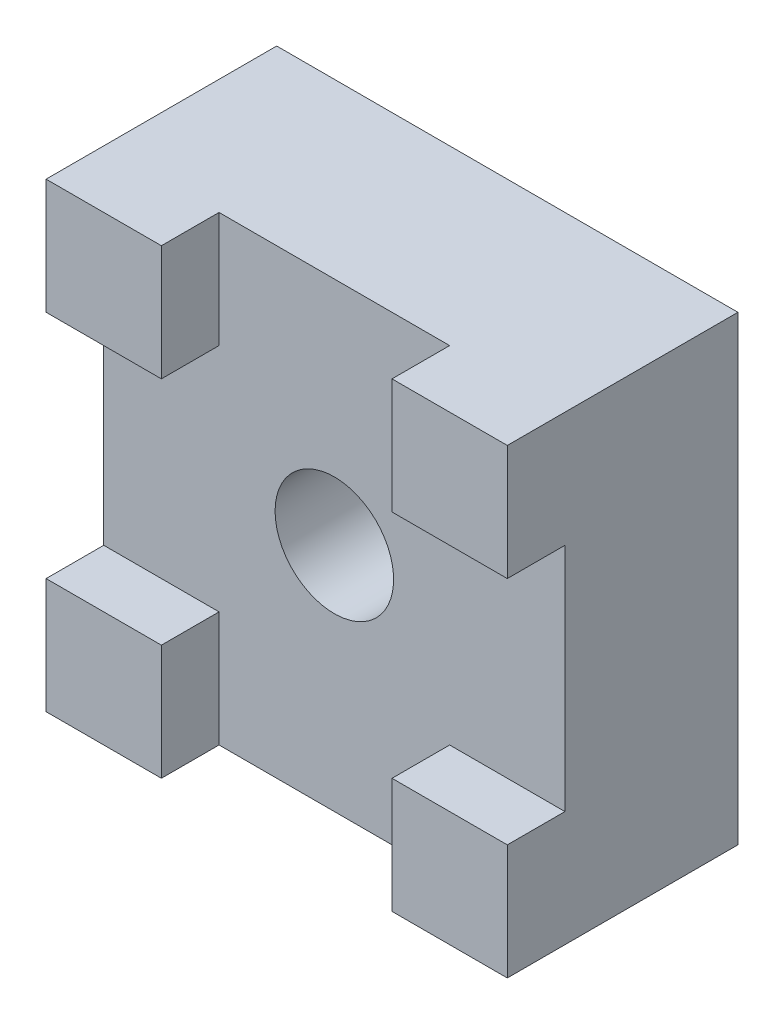
ISO-10303-21;
HEADER;
FILE_DESCRIPTION(('STEP AP214'),'2;1');
FILE_NAME('part.step','',(''),(''),'','','');
FILE_SCHEMA(('AUTOMOTIVE_DESIGN { 1 0 10303 214 1 1 1 1 }'));
ENDSEC;
DATA;
#1=APPLICATION_CONTEXT('core data for automotive mechanical design processes');
#2=APPLICATION_PROTOCOL_DEFINITION('international standard','automotive_design',2000,#1);
#3=PRODUCT_CONTEXT('',#1,'mechanical');
#4=PRODUCT('Part','Part','',(#3));
#5=PRODUCT_RELATED_PRODUCT_CATEGORY('part','',(#4));
#6=PRODUCT_DEFINITION_FORMATION('','',#4);
#7=PRODUCT_DEFINITION_CONTEXT('part definition',#1,'design');
#8=PRODUCT_DEFINITION('design','',#6,#7);
#9=PRODUCT_DEFINITION_SHAPE('','',#8);
#10=(LENGTH_UNIT() NAMED_UNIT(*) SI_UNIT(.MILLI.,.METRE.));
#11=(NAMED_UNIT(*) PLANE_ANGLE_UNIT() SI_UNIT($,.RADIAN.));
#12=(NAMED_UNIT(*) SI_UNIT($,.STERADIAN.) SOLID_ANGLE_UNIT());
#13=UNCERTAINTY_MEASURE_WITH_UNIT(LENGTH_MEASURE(1.E-05),#10,'distance_accuracy_value','');
#14=(GEOMETRIC_REPRESENTATION_CONTEXT(3) GLOBAL_UNCERTAINTY_ASSIGNED_CONTEXT((#13)) GLOBAL_UNIT_ASSIGNED_CONTEXT((#10,
#11,#12)) REPRESENTATION_CONTEXT('',''));
#15=CARTESIAN_POINT('',(0.,0.,0.));
#16=DIRECTION('',(0.,0.,1.));
#17=DIRECTION('',(1.,0.,0.));
#18=AXIS2_PLACEMENT_3D('',#15,#16,#17);
#19=CARTESIAN_POINT('',(-12.7,-12.7,9.525));
#20=DIRECTION('',(0.,1.,0.));
#21=DIRECTION('',(-1.,0.,0.));
#22=AXIS2_PLACEMENT_3D('',#19,#20,#21);
#23=PLANE('',#22);
#24=DIRECTION('',(1.,0.,0.));
#25=VECTOR('',#24,1.);
#26=CARTESIAN_POINT('',(-12.7,-12.7,0.));
#27=LINE('',#26,#25);
#28=CARTESIAN_POINT('',(-12.7,-12.7,0.));
#29=VERTEX_POINT('',#28);
#30=CARTESIAN_POINT('',(12.7,-12.7,0.));
#31=VERTEX_POINT('',#30);
#32=EDGE_CURVE('E307',#29,#31,#27,.T.);
#33=ORIENTED_EDGE('',*,*,#32,.T.);
#34=DIRECTION('',(0.,0.,-1.));
#35=VECTOR('',#34,1.);
#36=CARTESIAN_POINT('',(12.7,-12.7,9.525));
#37=LINE('',#36,#35);
#38=CARTESIAN_POINT('',(12.7,-12.7,12.7));
#39=VERTEX_POINT('',#38);
#40=EDGE_CURVE('E11',#39,#31,#37,.T.);
#41=ORIENTED_EDGE('',*,*,#40,.F.);
#42=DIRECTION('',(1.,0.,0.));
#43=VECTOR('',#42,1.);
#44=CARTESIAN_POINT('',(12.7,-12.7,12.7));
#45=LINE('',#44,#43);
#46=CARTESIAN_POINT('',(6.35,-12.7,12.7));
#47=VERTEX_POINT('',#46);
#48=EDGE_CURVE('E216',#47,#39,#45,.T.);
#49=ORIENTED_EDGE('',*,*,#48,.F.);
#50=DIRECTION('',(0.,0.,-1.));
#51=VECTOR('',#50,1.);
#52=CARTESIAN_POINT('',(6.35,-12.7,12.7));
#53=LINE('',#52,#51);
#54=CARTESIAN_POINT('',(6.35,-12.7,9.525));
#55=VERTEX_POINT('',#54);
#56=EDGE_CURVE('E215',#47,#55,#53,.T.);
#57=ORIENTED_EDGE('',*,*,#56,.T.);
#58=DIRECTION('',(1.,0.,0.));
#59=VECTOR('',#58,1.);
#60=CARTESIAN_POINT('',(-12.7,-12.7,9.525));
#61=LINE('',#60,#59);
#62=CARTESIAN_POINT('',(-6.35,-12.7,9.525));
#63=VERTEX_POINT('',#62);
#64=EDGE_CURVE('E315',#63,#55,#61,.T.);
#65=ORIENTED_EDGE('',*,*,#64,.F.);
#66=DIRECTION('',(0.,0.,-1.));
#67=VECTOR('',#66,1.);
#68=CARTESIAN_POINT('',(-6.35,-12.7,12.7));
#69=LINE('',#68,#67);
#70=CARTESIAN_POINT('',(-6.35,-12.7,12.7));
#71=VERTEX_POINT('',#70);
#72=EDGE_CURVE('E180',#71,#63,#69,.T.);
#73=ORIENTED_EDGE('',*,*,#72,.F.);
#74=DIRECTION('',(1.,0.,0.));
#75=VECTOR('',#74,1.);
#76=CARTESIAN_POINT('',(-12.7,-12.7,12.7));
#77=LINE('',#76,#75);
#78=CARTESIAN_POINT('',(-12.7,-12.7,12.7));
#79=VERTEX_POINT('',#78);
#80=EDGE_CURVE('E197',#79,#71,#77,.T.);
#81=ORIENTED_EDGE('',*,*,#80,.F.);
#82=DIRECTION('',(0.,0.,-1.));
#83=VECTOR('',#82,1.);
#84=CARTESIAN_POINT('',(-12.7,-12.7,9.525));
#85=LINE('',#84,#83);
#86=EDGE_CURVE('E324',#79,#29,#85,.T.);
#87=ORIENTED_EDGE('',*,*,#86,.T.);
#88=EDGE_LOOP('',(#33,#41,#49,#57,#65,#73,#81,#87));
#89=FACE_BOUND('',#88,.T.);
#90=ADVANCED_FACE('F44',(#89),#23,.F.);
#91=CARTESIAN_POINT('',(12.7,-12.7,9.525));
#92=DIRECTION('',(-1.,0.,0.));
#93=DIRECTION('',(0.,0.,1.));
#94=AXIS2_PLACEMENT_3D('',#91,#92,#93);
#95=PLANE('',#94);
#96=DIRECTION('',(0.,1.,0.));
#97=VECTOR('',#96,1.);
#98=CARTESIAN_POINT('',(12.7,-12.7,0.));
#99=LINE('',#98,#97);
#100=CARTESIAN_POINT('',(12.7,12.7,0.));
#101=VERTEX_POINT('',#100);
#102=EDGE_CURVE('E328',#31,#101,#99,.T.);
#103=ORIENTED_EDGE('',*,*,#102,.T.);
#104=DIRECTION('',(0.,0.,-1.));
#105=VECTOR('',#104,1.);
#106=CARTESIAN_POINT('',(12.7,12.7,9.525));
#107=LINE('',#106,#105);
#108=CARTESIAN_POINT('',(12.7,12.7,12.7));
#109=VERTEX_POINT('',#108);
#110=EDGE_CURVE('E53',#109,#101,#107,.T.);
#111=ORIENTED_EDGE('',*,*,#110,.F.);
#112=DIRECTION('',(0.,1.,0.));
#113=VECTOR('',#112,1.);
#114=CARTESIAN_POINT('',(12.7,12.7,12.7));
#115=LINE('',#114,#113);
#116=CARTESIAN_POINT('',(12.7,6.35,12.7));
#117=VERTEX_POINT('',#116);
#118=EDGE_CURVE('E260',#117,#109,#115,.T.);
#119=ORIENTED_EDGE('',*,*,#118,.F.);
#120=DIRECTION('',(0.,0.,-1.));
#121=VECTOR('',#120,1.);
#122=CARTESIAN_POINT('',(12.7,6.35,12.7));
#123=LINE('',#122,#121);
#124=CARTESIAN_POINT('',(12.7,6.35,9.525));
#125=VERTEX_POINT('',#124);
#126=EDGE_CURVE('E238',#117,#125,#123,.T.);
#127=ORIENTED_EDGE('',*,*,#126,.T.);
#128=DIRECTION('',(0.,1.,0.));
#129=VECTOR('',#128,1.);
#130=CARTESIAN_POINT('',(12.7,-12.7,9.525));
#131=LINE('',#130,#129);
#132=CARTESIAN_POINT('',(12.7,-6.35,9.525));
#133=VERTEX_POINT('',#132);
#134=EDGE_CURVE('E312',#133,#125,#131,.T.);
#135=ORIENTED_EDGE('',*,*,#134,.F.);
#136=DIRECTION('',(0.,0.,-1.));
#137=VECTOR('',#136,1.);
#138=CARTESIAN_POINT('',(12.7,-6.35,12.7));
#139=LINE('',#138,#137);
#140=CARTESIAN_POINT('',(12.7,-6.35,12.7));
#141=VERTEX_POINT('',#140);
#142=EDGE_CURVE('E201',#141,#133,#139,.T.);
#143=ORIENTED_EDGE('',*,*,#142,.F.);
#144=DIRECTION('',(0.,1.,0.));
#145=VECTOR('',#144,1.);
#146=CARTESIAN_POINT('',(12.7,-12.7,12.7));
#147=LINE('',#146,#145);
#148=EDGE_CURVE('E222',#39,#141,#147,.T.);
#149=ORIENTED_EDGE('',*,*,#148,.F.);
#150=ORIENTED_EDGE('',*,*,#40,.T.);
#151=EDGE_LOOP('',(#103,#111,#119,#127,#135,#143,#149,#150));
#152=FACE_BOUND('',#151,.T.);
#153=ADVANCED_FACE('F355',(#152),#95,.F.);
#154=CARTESIAN_POINT('',(-12.7,12.7,9.525));
#155=DIRECTION('',(0.,1.,0.));
#156=DIRECTION('',(-1.,0.,0.));
#157=AXIS2_PLACEMENT_3D('',#154,#155,#156);
#158=PLANE('',#157);
#159=DIRECTION('',(1.,0.,0.));
#160=VECTOR('',#159,1.);
#161=CARTESIAN_POINT('',(-12.7,12.7,0.));
#162=LINE('',#161,#160);
#163=CARTESIAN_POINT('',(-12.7,12.7,0.));
#164=VERTEX_POINT('',#163);
#165=EDGE_CURVE('E334',#164,#101,#162,.T.);
#166=ORIENTED_EDGE('',*,*,#165,.F.);
#167=DIRECTION('',(0.,0.,-1.));
#168=VECTOR('',#167,1.);
#169=CARTESIAN_POINT('',(-12.7,12.7,9.525));
#170=LINE('',#169,#168);
#171=CARTESIAN_POINT('',(-12.7,12.7,12.7));
#172=VERTEX_POINT('',#171);
#173=EDGE_CURVE('E341',#172,#164,#170,.T.);
#174=ORIENTED_EDGE('',*,*,#173,.F.);
#175=DIRECTION('',(-1.,0.,0.));
#176=VECTOR('',#175,1.);
#177=CARTESIAN_POINT('',(-12.7,12.7,12.7));
#178=LINE('',#177,#176);
#179=CARTESIAN_POINT('',(-6.35,12.7,12.7));
#180=VERTEX_POINT('',#179);
#181=EDGE_CURVE('E279',#180,#172,#178,.T.);
#182=ORIENTED_EDGE('',*,*,#181,.F.);
#183=DIRECTION('',(0.,0.,-1.));
#184=VECTOR('',#183,1.);
#185=CARTESIAN_POINT('',(-6.35,12.7,12.7));
#186=LINE('',#185,#184);
#187=CARTESIAN_POINT('',(-6.35,12.7,9.525));
#188=VERTEX_POINT('',#187);
#189=EDGE_CURVE('E281',#180,#188,#186,.T.);
#190=ORIENTED_EDGE('',*,*,#189,.T.);
#191=DIRECTION('',(1.,0.,0.));
#192=VECTOR('',#191,1.);
#193=CARTESIAN_POINT('',(-12.7,12.7,9.525));
#194=LINE('',#193,#192);
#195=CARTESIAN_POINT('',(6.35,12.7,9.525));
#196=VERTEX_POINT('',#195);
#197=EDGE_CURVE('E317',#188,#196,#194,.T.);
#198=ORIENTED_EDGE('',*,*,#197,.T.);
#199=DIRECTION('',(0.,0.,-1.));
#200=VECTOR('',#199,1.);
#201=CARTESIAN_POINT('',(6.35,12.7,12.7));
#202=LINE('',#201,#200);
#203=CARTESIAN_POINT('',(6.35,12.7,12.7));
#204=VERTEX_POINT('',#203);
#205=EDGE_CURVE('E243',#204,#196,#202,.T.);
#206=ORIENTED_EDGE('',*,*,#205,.F.);
#207=DIRECTION('',(-1.,0.,0.));
#208=VECTOR('',#207,1.);
#209=CARTESIAN_POINT('',(6.35,12.7,12.7));
#210=LINE('',#209,#208);
#211=EDGE_CURVE('E250',#109,#204,#210,.T.);
#212=ORIENTED_EDGE('',*,*,#211,.F.);
#213=ORIENTED_EDGE('',*,*,#110,.T.);
#214=EDGE_LOOP('',(#166,#174,#182,#190,#198,#206,#212,#213));
#215=FACE_BOUND('',#214,.T.);
#216=ADVANCED_FACE('F349',(#215),#158,.T.);
#217=CARTESIAN_POINT('',(-12.7,-12.7,9.525));
#218=DIRECTION('',(-1.,0.,0.));
#219=DIRECTION('',(0.,0.,1.));
#220=AXIS2_PLACEMENT_3D('',#217,#218,#219);
#221=PLANE('',#220);
#222=DIRECTION('',(0.,1.,0.));
#223=VECTOR('',#222,1.);
#224=CARTESIAN_POINT('',(-12.7,-12.7,0.));
#225=LINE('',#224,#223);
#226=EDGE_CURVE('E316',#29,#164,#225,.T.);
#227=ORIENTED_EDGE('',*,*,#226,.F.);
#228=ORIENTED_EDGE('',*,*,#86,.F.);
#229=DIRECTION('',(0.,-1.,0.));
#230=VECTOR('',#229,1.);
#231=CARTESIAN_POINT('',(-12.7,-6.35,12.7));
#232=LINE('',#231,#230);
#233=CARTESIAN_POINT('',(-12.7,-6.35,12.7));
#234=VERTEX_POINT('',#233);
#235=EDGE_CURVE('E169',#234,#79,#232,.T.);
#236=ORIENTED_EDGE('',*,*,#235,.F.);
#237=DIRECTION('',(0.,0.,-1.));
#238=VECTOR('',#237,1.);
#239=CARTESIAN_POINT('',(-12.7,-6.35,12.7));
#240=LINE('',#239,#238);
#241=CARTESIAN_POINT('',(-12.7,-6.35,9.525));
#242=VERTEX_POINT('',#241);
#243=EDGE_CURVE('E184',#234,#242,#240,.T.);
#244=ORIENTED_EDGE('',*,*,#243,.T.);
#245=DIRECTION('',(0.,1.,0.));
#246=VECTOR('',#245,1.);
#247=CARTESIAN_POINT('',(-12.7,-12.7,9.525));
#248=LINE('',#247,#246);
#249=CARTESIAN_POINT('',(-12.7,6.34999999999999,9.525));
#250=VERTEX_POINT('',#249);
#251=EDGE_CURVE('E165',#242,#250,#248,.T.);
#252=ORIENTED_EDGE('',*,*,#251,.T.);
#253=DIRECTION('',(0.,0.,-1.));
#254=VECTOR('',#253,1.);
#255=CARTESIAN_POINT('',(-12.7,6.35,12.7));
#256=LINE('',#255,#254);
#257=CARTESIAN_POINT('',(-12.7,6.35,12.7));
#258=VERTEX_POINT('',#257);
#259=EDGE_CURVE('E293',#258,#250,#256,.T.);
#260=ORIENTED_EDGE('',*,*,#259,.F.);
#261=DIRECTION('',(0.,-1.,0.));
#262=VECTOR('',#261,1.);
#263=CARTESIAN_POINT('',(-12.7,12.7,12.7));
#264=LINE('',#263,#262);
#265=EDGE_CURVE('E270',#172,#258,#264,.T.);
#266=ORIENTED_EDGE('',*,*,#265,.F.);
#267=ORIENTED_EDGE('',*,*,#173,.T.);
#268=EDGE_LOOP('',(#227,#228,#236,#244,#252,#260,#266,#267));
#269=FACE_BOUND('',#268,.T.);
#270=ADVANCED_FACE('F357',(#269),#221,.T.);
#271=CARTESIAN_POINT('',(0.,0.,9.525));
#272=DIRECTION('',(0.,0.,1.));
#273=DIRECTION('',(1.,0.,0.));
#274=AXIS2_PLACEMENT_3D('',#271,#272,#273);
#275=PLANE('',#274);
#276=DIRECTION('',(0.,-1.,0.));
#277=VECTOR('',#276,1.);
#278=CARTESIAN_POINT('',(6.35,12.7,9.525));
#279=LINE('',#278,#277);
#280=CARTESIAN_POINT('',(6.35,6.35,9.525));
#281=VERTEX_POINT('',#280);
#282=EDGE_CURVE('E208',#196,#281,#279,.T.);
#283=ORIENTED_EDGE('',*,*,#282,.F.);
#284=ORIENTED_EDGE('',*,*,#197,.F.);
#285=DIRECTION('',(0.,1.,0.));
#286=VECTOR('',#285,1.);
#287=CARTESIAN_POINT('',(-6.35,12.7,9.525));
#288=LINE('',#287,#286);
#289=CARTESIAN_POINT('',(-6.35,6.35,9.525));
#290=VERTEX_POINT('',#289);
#291=EDGE_CURVE('E275',#290,#188,#288,.T.);
#292=ORIENTED_EDGE('',*,*,#291,.F.);
#293=DIRECTION('',(1.,0.,0.));
#294=VECTOR('',#293,1.);
#295=CARTESIAN_POINT('',(-12.7,6.35,9.525));
#296=LINE('',#295,#294);
#297=EDGE_CURVE('E70',#250,#290,#296,.T.);
#298=ORIENTED_EDGE('',*,*,#297,.F.);
#299=ORIENTED_EDGE('',*,*,#251,.F.);
#300=DIRECTION('',(-1.,0.,0.));
#301=VECTOR('',#300,1.);
#302=CARTESIAN_POINT('',(-12.7,-6.35,9.525));
#303=LINE('',#302,#301);
#304=CARTESIAN_POINT('',(-6.35,-6.35,9.525));
#305=VERTEX_POINT('',#304);
#306=EDGE_CURVE('E156',#305,#242,#303,.T.);
#307=ORIENTED_EDGE('',*,*,#306,.F.);
#308=DIRECTION('',(0.,1.,0.));
#309=VECTOR('',#308,1.);
#310=CARTESIAN_POINT('',(-6.35,-6.35,9.525));
#311=LINE('',#310,#309);
#312=EDGE_CURVE('E159',#63,#305,#311,.T.);
#313=ORIENTED_EDGE('',*,*,#312,.F.);
#314=ORIENTED_EDGE('',*,*,#64,.T.);
#315=DIRECTION('',(0.,-1.,0.));
#316=VECTOR('',#315,1.);
#317=CARTESIAN_POINT('',(6.35,-12.7,9.525));
#318=LINE('',#317,#316);
#319=CARTESIAN_POINT('',(6.35,-6.35,9.525));
#320=VERTEX_POINT('',#319);
#321=EDGE_CURVE('E220',#320,#55,#318,.T.);
#322=ORIENTED_EDGE('',*,*,#321,.F.);
#323=DIRECTION('',(-1.,0.,0.));
#324=VECTOR('',#323,1.);
#325=CARTESIAN_POINT('',(12.7,-6.35,9.525));
#326=LINE('',#325,#324);
#327=EDGE_CURVE('E188',#133,#320,#326,.T.);
#328=ORIENTED_EDGE('',*,*,#327,.F.);
#329=ORIENTED_EDGE('',*,*,#134,.T.);
#330=DIRECTION('',(1.,0.,0.));
#331=VECTOR('',#330,1.);
#332=CARTESIAN_POINT('',(6.35,6.35,9.525));
#333=LINE('',#332,#331);
#334=EDGE_CURVE('E64',#281,#125,#333,.T.);
#335=ORIENTED_EDGE('',*,*,#334,.F.);
#336=EDGE_LOOP('',(#283,#284,#292,#298,#299,#307,#313,#314,#322,#328,#329,#335));
#337=FACE_BOUND('',#336,.T.);
#338=CARTESIAN_POINT('',(0.,0.,9.525));
#339=DIRECTION('',(0.,0.,1.));
#340=DIRECTION('',(1.,0.,0.));
#341=AXIS2_PLACEMENT_3D('',#338,#339,#340);
#342=CIRCLE('',#341,3.2639);
#343=CARTESIAN_POINT('',(-3.2639,0.,9.525));
#344=VERTEX_POINT('',#343);
#345=EDGE_CURVE('E298',#344,#344,#342,.T.);
#346=ORIENTED_EDGE('',*,*,#345,.F.);
#347=EDGE_LOOP('',(#346));
#348=FACE_BOUND('',#347,.T.);
#349=ADVANCED_FACE('F158',(#337,#348),#275,.T.);
#350=CARTESIAN_POINT('',(0.,0.,0.));
#351=DIRECTION('',(0.,0.,1.));
#352=DIRECTION('',(1.,0.,0.));
#353=AXIS2_PLACEMENT_3D('',#350,#351,#352);
#354=PLANE('',#353);
#355=CARTESIAN_POINT('',(0.,0.,0.));
#356=DIRECTION('',(0.,0.,-1.));
#357=DIRECTION('',(-1.,0.,0.));
#358=AXIS2_PLACEMENT_3D('',#355,#356,#357);
#359=CIRCLE('',#358,6.35);
#360=CARTESIAN_POINT('',(-6.35,0.,0.));
#361=VERTEX_POINT('',#360);
#362=EDGE_CURVE('E306',#361,#361,#359,.T.);
#363=ORIENTED_EDGE('',*,*,#362,.F.);
#364=EDGE_LOOP('',(#363));
#365=FACE_BOUND('',#364,.T.);
#366=ORIENTED_EDGE('',*,*,#32,.F.);
#367=ORIENTED_EDGE('',*,*,#226,.T.);
#368=ORIENTED_EDGE('',*,*,#165,.T.);
#369=ORIENTED_EDGE('',*,*,#102,.F.);
#370=EDGE_LOOP('',(#366,#367,#368,#369));
#371=FACE_BOUND('',#370,.T.);
#372=ADVANCED_FACE('F356',(#365,#371),#354,.F.);
#373=CARTESIAN_POINT('',(0.,0.,4.7752));
#374=DIRECTION('',(0.,0.,-1.));
#375=DIRECTION('',(-1.,0.,0.));
#376=AXIS2_PLACEMENT_3D('',#373,#374,#375);
#377=CYLINDRICAL_SURFACE('',#376,6.35);
#378=CARTESIAN_POINT('',(0.,0.,4.7752));
#379=DIRECTION('',(0.,0.,-1.));
#380=DIRECTION('',(-1.,0.,0.));
#381=AXIS2_PLACEMENT_3D('',#378,#379,#380);
#382=CIRCLE('',#381,6.35);
#383=CARTESIAN_POINT('',(-6.35,0.,4.7752));
#384=VERTEX_POINT('',#383);
#385=EDGE_CURVE('E305',#384,#384,#382,.T.);
#386=ORIENTED_EDGE('',*,*,#385,.F.);
#387=EDGE_LOOP('',(#386));
#388=FACE_BOUND('',#387,.T.);
#389=ORIENTED_EDGE('',*,*,#362,.T.);
#390=EDGE_LOOP('',(#389));
#391=FACE_BOUND('',#390,.T.);
#392=ADVANCED_FACE('F420',(#388,#391),#377,.F.);
#393=CARTESIAN_POINT('',(0.,0.,4.7752));
#394=DIRECTION('',(0.,0.,-1.));
#395=DIRECTION('',(-1.,0.,0.));
#396=AXIS2_PLACEMENT_3D('',#393,#394,#395);
#397=PLANE('',#396);
#398=CARTESIAN_POINT('',(0.,0.,4.7752));
#399=DIRECTION('',(0.,0.,-1.));
#400=DIRECTION('',(-1.,0.,0.));
#401=AXIS2_PLACEMENT_3D('',#398,#399,#400);
#402=CIRCLE('',#401,3.2639);
#403=CARTESIAN_POINT('',(-3.2639,0.,4.7752));
#404=VERTEX_POINT('',#403);
#405=EDGE_CURVE('E48',#404,#404,#402,.F.);
#406=ORIENTED_EDGE('',*,*,#405,.T.);
#407=EDGE_LOOP('',(#406));
#408=FACE_BOUND('',#407,.T.);
#409=ORIENTED_EDGE('',*,*,#385,.T.);
#410=EDGE_LOOP('',(#409));
#411=FACE_BOUND('',#410,.T.);
#412=ADVANCED_FACE('F411',(#408,#411),#397,.T.);
#413=CARTESIAN_POINT('',(0.,0.,9.525));
#414=DIRECTION('',(0.,0.,-1.));
#415=DIRECTION('',(-1.,0.,0.));
#416=AXIS2_PLACEMENT_3D('',#413,#414,#415);
#417=CYLINDRICAL_SURFACE('',#416,3.2639);
#418=CARTESIAN_POINT('',(-3.2639,0.,4.7752));
#419=CARTESIAN_POINT('',(-3.2639,0.,4.82467708333333));
#420=CARTESIAN_POINT('',(-3.2639,0.,4.87415416666667));
#421=CARTESIAN_POINT('',(-3.2639,0.,4.97310833333333));
#422=CARTESIAN_POINT('',(-3.2639,0.,5.02258541666667));
#423=CARTESIAN_POINT('',(-3.2639,0.,5.12153958333333));
#424=CARTESIAN_POINT('',(-3.2639,0.,5.17101666666667));
#425=CARTESIAN_POINT('',(-3.2639,0.,5.26997083333333));
#426=CARTESIAN_POINT('',(-3.2639,0.,5.31944791666667));
#427=CARTESIAN_POINT('',(-3.2639,0.,5.41840208333333));
#428=CARTESIAN_POINT('',(-3.2639,0.,5.46787916666667));
#429=CARTESIAN_POINT('',(-3.2639,0.,5.56683333333333));
#430=CARTESIAN_POINT('',(-3.2639,0.,5.61631041666667));
#431=CARTESIAN_POINT('',(-3.2639,0.,5.71526458333333));
#432=CARTESIAN_POINT('',(-3.2639,0.,5.76474166666667));
#433=CARTESIAN_POINT('',(-3.2639,0.,5.86369583333333));
#434=CARTESIAN_POINT('',(-3.2639,0.,5.91317291666667));
#435=CARTESIAN_POINT('',(-3.2639,0.,6.01212708333333));
#436=CARTESIAN_POINT('',(-3.2639,0.,6.06160416666667));
#437=CARTESIAN_POINT('',(-3.2639,0.,6.16055833333333));
#438=CARTESIAN_POINT('',(-3.2639,0.,6.21003541666667));
#439=CARTESIAN_POINT('',(-3.2639,0.,6.30898958333333));
#440=CARTESIAN_POINT('',(-3.2639,0.,6.35846666666667));
#441=CARTESIAN_POINT('',(-3.2639,0.,6.45742083333333));
#442=CARTESIAN_POINT('',(-3.2639,0.,6.50689791666667));
#443=CARTESIAN_POINT('',(-3.2639,0.,6.60585208333333));
#444=CARTESIAN_POINT('',(-3.2639,0.,6.65532916666667));
#445=CARTESIAN_POINT('',(-3.2639,0.,6.75428333333333));
#446=CARTESIAN_POINT('',(-3.2639,0.,6.80376041666667));
#447=CARTESIAN_POINT('',(-3.2639,0.,6.90271458333333));
#448=CARTESIAN_POINT('',(-3.2639,0.,6.95219166666667));
#449=CARTESIAN_POINT('',(-3.2639,0.,7.05114583333333));
#450=CARTESIAN_POINT('',(-3.2639,0.,7.10062291666667));
#451=CARTESIAN_POINT('',(-3.2639,0.,7.19957708333333));
#452=CARTESIAN_POINT('',(-3.2639,0.,7.24905416666667));
#453=CARTESIAN_POINT('',(-3.2639,0.,7.34800833333333));
#454=CARTESIAN_POINT('',(-3.2639,0.,7.39748541666667));
#455=CARTESIAN_POINT('',(-3.2639,0.,7.49643958333333));
#456=CARTESIAN_POINT('',(-3.2639,0.,7.54591666666667));
#457=CARTESIAN_POINT('',(-3.2639,0.,7.64487083333333));
#458=CARTESIAN_POINT('',(-3.2639,0.,7.69434791666667));
#459=CARTESIAN_POINT('',(-3.2639,0.,7.79330208333333));
#460=CARTESIAN_POINT('',(-3.2639,0.,7.84277916666667));
#461=CARTESIAN_POINT('',(-3.2639,0.,7.94173333333333));
#462=CARTESIAN_POINT('',(-3.2639,0.,7.99121041666667));
#463=CARTESIAN_POINT('',(-3.2639,0.,8.09016458333333));
#464=CARTESIAN_POINT('',(-3.2639,0.,8.13964166666667));
#465=CARTESIAN_POINT('',(-3.2639,0.,8.23859583333333));
#466=CARTESIAN_POINT('',(-3.2639,0.,8.28807291666667));
#467=CARTESIAN_POINT('',(-3.2639,0.,8.38702708333333));
#468=CARTESIAN_POINT('',(-3.2639,0.,8.43650416666667));
#469=CARTESIAN_POINT('',(-3.2639,0.,8.53545833333333));
#470=CARTESIAN_POINT('',(-3.2639,0.,8.58493541666667));
#471=CARTESIAN_POINT('',(-3.2639,0.,8.68388958333333));
#472=CARTESIAN_POINT('',(-3.2639,0.,8.73336666666667));
#473=CARTESIAN_POINT('',(-3.2639,0.,8.83232083333333));
#474=CARTESIAN_POINT('',(-3.2639,0.,8.88179791666667));
#475=CARTESIAN_POINT('',(-3.2639,0.,8.98075208333333));
#476=CARTESIAN_POINT('',(-3.2639,0.,9.03022916666667));
#477=CARTESIAN_POINT('',(-3.2639,0.,9.12918333333333));
#478=CARTESIAN_POINT('',(-3.2639,0.,9.17866041666667));
#479=CARTESIAN_POINT('',(-3.2639,0.,9.27761458333333));
#480=CARTESIAN_POINT('',(-3.2639,0.,9.32709166666667));
#481=CARTESIAN_POINT('',(-3.2639,0.,9.42604583333333));
#482=CARTESIAN_POINT('',(-3.2639,0.,9.47552291666667));
#483=CARTESIAN_POINT('',(-3.2639,0.,9.525));
#484=B_SPLINE_CURVE_WITH_KNOTS('',3,(#418,#419,#420,#421,#422,#423,#424,#425,#426,#427,#428,
#429,#430,#431,#432,#433,#434,#435,#436,#437,#438,#439,#440,#441,#442,#443,#444,#445,#446,#447,
#448,#449,#450,#451,#452,#453,#454,#455,#456,#457,#458,#459,#460,#461,#462,#463,#464,#465,#466,
#467,#468,#469,#470,#471,#472,#473,#474,#475,#476,#477,#478,#479,#480,#481,#482,#483),
.UNSPECIFIED.,.F.,.F.,(4,2,2,2,2,2,2,2,2,2,2,2,2,2,2,2,2,2,2,2,2,2,2,2,2,2,2,2,2,2,2,2,4),(0.,
0.14843125,0.2968625,0.44529375,0.593725,0.74215625,0.890587499999999,1.03901875,1.18745,
1.33588125,1.4843125,1.63274375,1.781175,1.92960625,2.0780375,2.22646875,2.3749,2.52333125,
2.6717625,2.82019375,2.968625,3.11705625,3.2654875,3.41391875,3.56235,3.71078125,3.8592125,
4.00764375,4.156075,4.30450625,4.4529375,4.60136875,4.7498),.UNSPECIFIED.);
#485=EDGE_CURVE('BSEAM403',#404,#344,#484,.T.);
#486=ORIENTED_EDGE('',*,*,#405,.F.);
#487=ORIENTED_EDGE('',*,*,#345,.T.);
#488=ORIENTED_EDGE('',*,*,#485,.T.);
#489=ORIENTED_EDGE('',*,*,#485,.F.);
#490=EDGE_LOOP('',(#486,#488,#487,#489));
#491=FACE_BOUND('',#490,.T.);
#492=ADVANCED_FACE('F403',(#491),#417,.F.);
#493=CARTESIAN_POINT('',(-12.7,6.35,12.7));
#494=DIRECTION('',(0.,1.,0.));
#495=DIRECTION('',(0.,0.,1.));
#496=AXIS2_PLACEMENT_3D('',#493,#494,#495);
#497=PLANE('',#496);
#498=ORIENTED_EDGE('',*,*,#297,.T.);
#499=DIRECTION('',(0.,0.,-1.));
#500=VECTOR('',#499,1.);
#501=CARTESIAN_POINT('',(-6.35,6.35,12.7));
#502=LINE('',#501,#500);
#503=CARTESIAN_POINT('',(-6.35,6.35,12.7));
#504=VERTEX_POINT('',#503);
#505=EDGE_CURVE('E292',#504,#290,#502,.T.);
#506=ORIENTED_EDGE('',*,*,#505,.F.);
#507=DIRECTION('',(1.,0.,0.));
#508=VECTOR('',#507,1.);
#509=CARTESIAN_POINT('',(-12.7,6.35,12.7));
#510=LINE('',#509,#508);
#511=EDGE_CURVE('E271',#258,#504,#510,.T.);
#512=ORIENTED_EDGE('',*,*,#511,.F.);
#513=ORIENTED_EDGE('',*,*,#259,.T.);
#514=EDGE_LOOP('',(#498,#506,#512,#513));
#515=FACE_BOUND('',#514,.T.);
#516=ADVANCED_FACE('F401',(#515),#497,.F.);
#517=CARTESIAN_POINT('',(-6.35,12.7,12.7));
#518=DIRECTION('',(-1.,0.,0.));
#519=DIRECTION('',(0.,0.,1.));
#520=AXIS2_PLACEMENT_3D('',#517,#518,#519);
#521=PLANE('',#520);
#522=ORIENTED_EDGE('',*,*,#291,.T.);
#523=ORIENTED_EDGE('',*,*,#189,.F.);
#524=DIRECTION('',(0.,1.,0.));
#525=VECTOR('',#524,1.);
#526=CARTESIAN_POINT('',(-6.35,12.7,12.7));
#527=LINE('',#526,#525);
#528=EDGE_CURVE('E274',#504,#180,#527,.T.);
#529=ORIENTED_EDGE('',*,*,#528,.F.);
#530=ORIENTED_EDGE('',*,*,#505,.T.);
#531=EDGE_LOOP('',(#522,#523,#529,#530));
#532=FACE_BOUND('',#531,.T.);
#533=ADVANCED_FACE('F375',(#532),#521,.F.);
#534=CARTESIAN_POINT('',(0.,0.,12.7));
#535=DIRECTION('',(0.,0.,1.));
#536=DIRECTION('',(1.,0.,0.));
#537=AXIS2_PLACEMENT_3D('',#534,#535,#536);
#538=PLANE('',#537);
#539=ORIENTED_EDGE('',*,*,#265,.T.);
#540=ORIENTED_EDGE('',*,*,#511,.T.);
#541=ORIENTED_EDGE('',*,*,#528,.T.);
#542=ORIENTED_EDGE('',*,*,#181,.T.);
#543=EDGE_LOOP('',(#539,#540,#541,#542));
#544=FACE_BOUND('',#543,.T.);
#545=ADVANCED_FACE('F370',(#544),#538,.T.);
#546=CARTESIAN_POINT('',(-6.35,-6.35,12.7));
#547=DIRECTION('',(-1.,0.,0.));
#548=DIRECTION('',(0.,0.,1.));
#549=AXIS2_PLACEMENT_3D('',#546,#547,#548);
#550=PLANE('',#549);
#551=ORIENTED_EDGE('',*,*,#312,.T.);
#552=DIRECTION('',(0.,0.,-1.));
#553=VECTOR('',#552,1.);
#554=CARTESIAN_POINT('',(-6.35,-6.35,12.7));
#555=LINE('',#554,#553);
#556=CARTESIAN_POINT('',(-6.35,-6.35,12.7));
#557=VERTEX_POINT('',#556);
#558=EDGE_CURVE('E172',#557,#305,#555,.T.);
#559=ORIENTED_EDGE('',*,*,#558,.F.);
#560=DIRECTION('',(0.,1.,0.));
#561=VECTOR('',#560,1.);
#562=CARTESIAN_POINT('',(-6.35,-6.35,12.7));
#563=LINE('',#562,#561);
#564=EDGE_CURVE('E193',#71,#557,#563,.T.);
#565=ORIENTED_EDGE('',*,*,#564,.F.);
#566=ORIENTED_EDGE('',*,*,#72,.T.);
#567=EDGE_LOOP('',(#551,#559,#565,#566));
#568=FACE_BOUND('',#567,.T.);
#569=ADVANCED_FACE('F175',(#568),#550,.F.);
#570=CARTESIAN_POINT('',(-12.7,-6.35,12.7));
#571=DIRECTION('',(0.,-1.,0.));
#572=DIRECTION('',(0.,0.,-1.));
#573=AXIS2_PLACEMENT_3D('',#570,#571,#572);
#574=PLANE('',#573);
#575=ORIENTED_EDGE('',*,*,#306,.T.);
#576=ORIENTED_EDGE('',*,*,#243,.F.);
#577=DIRECTION('',(-1.,0.,0.));
#578=VECTOR('',#577,1.);
#579=CARTESIAN_POINT('',(-12.7,-6.35,12.7));
#580=LINE('',#579,#578);
#581=EDGE_CURVE('E185',#557,#234,#580,.T.);
#582=ORIENTED_EDGE('',*,*,#581,.F.);
#583=ORIENTED_EDGE('',*,*,#558,.T.);
#584=EDGE_LOOP('',(#575,#576,#582,#583));
#585=FACE_BOUND('',#584,.T.);
#586=ADVANCED_FACE('F182',(#585),#574,.F.);
#587=CARTESIAN_POINT('',(0.,0.,12.7));
#588=DIRECTION('',(0.,0.,1.));
#589=DIRECTION('',(1.,0.,0.));
#590=AXIS2_PLACEMENT_3D('',#587,#588,#589);
#591=PLANE('',#590);
#592=ORIENTED_EDGE('',*,*,#235,.T.);
#593=ORIENTED_EDGE('',*,*,#80,.T.);
#594=ORIENTED_EDGE('',*,*,#564,.T.);
#595=ORIENTED_EDGE('',*,*,#581,.T.);
#596=EDGE_LOOP('',(#592,#593,#594,#595));
#597=FACE_BOUND('',#596,.T.);
#598=ADVANCED_FACE('F402',(#597),#591,.T.);
#599=CARTESIAN_POINT('',(12.7,-6.35,12.7));
#600=DIRECTION('',(0.,-1.,0.));
#601=DIRECTION('',(0.,0.,-1.));
#602=AXIS2_PLACEMENT_3D('',#599,#600,#601);
#603=PLANE('',#602);
#604=ORIENTED_EDGE('',*,*,#327,.T.);
#605=DIRECTION('',(0.,0.,-1.));
#606=VECTOR('',#605,1.);
#607=CARTESIAN_POINT('',(6.35,-6.35,12.7));
#608=LINE('',#607,#606);
#609=CARTESIAN_POINT('',(6.35,-6.35,12.7));
#610=VERTEX_POINT('',#609);
#611=EDGE_CURVE('E210',#610,#320,#608,.T.);
#612=ORIENTED_EDGE('',*,*,#611,.F.);
#613=DIRECTION('',(-1.,0.,0.));
#614=VECTOR('',#613,1.);
#615=CARTESIAN_POINT('',(12.7,-6.35,12.7));
#616=LINE('',#615,#614);
#617=EDGE_CURVE('E234',#141,#610,#616,.T.);
#618=ORIENTED_EDGE('',*,*,#617,.F.);
#619=ORIENTED_EDGE('',*,*,#142,.T.);
#620=EDGE_LOOP('',(#604,#612,#618,#619));
#621=FACE_BOUND('',#620,.T.);
#622=ADVANCED_FACE('F537',(#621),#603,.F.);
#623=CARTESIAN_POINT('',(6.35,-12.7,12.7));
#624=DIRECTION('',(1.,0.,0.));
#625=DIRECTION('',(0.,0.,-1.));
#626=AXIS2_PLACEMENT_3D('',#623,#624,#625);
#627=PLANE('',#626);
#628=ORIENTED_EDGE('',*,*,#321,.T.);
#629=ORIENTED_EDGE('',*,*,#56,.F.);
#630=DIRECTION('',(0.,-1.,0.));
#631=VECTOR('',#630,1.);
#632=CARTESIAN_POINT('',(6.35,-12.7,12.7));
#633=LINE('',#632,#631);
#634=EDGE_CURVE('E230',#610,#47,#633,.T.);
#635=ORIENTED_EDGE('',*,*,#634,.F.);
#636=ORIENTED_EDGE('',*,*,#611,.T.);
#637=EDGE_LOOP('',(#628,#629,#635,#636));
#638=FACE_BOUND('',#637,.T.);
#639=ADVANCED_FACE('F550',(#638),#627,.F.);
#640=CARTESIAN_POINT('',(0.,0.,12.7));
#641=DIRECTION('',(0.,0.,1.));
#642=DIRECTION('',(1.,0.,0.));
#643=AXIS2_PLACEMENT_3D('',#640,#641,#642);
#644=PLANE('',#643);
#645=ORIENTED_EDGE('',*,*,#148,.T.);
#646=ORIENTED_EDGE('',*,*,#617,.T.);
#647=ORIENTED_EDGE('',*,*,#634,.T.);
#648=ORIENTED_EDGE('',*,*,#48,.T.);
#649=EDGE_LOOP('',(#645,#646,#647,#648));
#650=FACE_BOUND('',#649,.T.);
#651=ADVANCED_FACE('F394',(#650),#644,.T.);
#652=CARTESIAN_POINT('',(6.35,12.7,12.7));
#653=DIRECTION('',(1.,0.,0.));
#654=DIRECTION('',(0.,0.,-1.));
#655=AXIS2_PLACEMENT_3D('',#652,#653,#654);
#656=PLANE('',#655);
#657=ORIENTED_EDGE('',*,*,#282,.T.);
#658=DIRECTION('',(0.,0.,-1.));
#659=VECTOR('',#658,1.);
#660=CARTESIAN_POINT('',(6.35,6.35,12.7));
#661=LINE('',#660,#659);
#662=CARTESIAN_POINT('',(6.35,6.35,12.7));
#663=VERTEX_POINT('',#662);
#664=EDGE_CURVE('E240',#663,#281,#661,.T.);
#665=ORIENTED_EDGE('',*,*,#664,.F.);
#666=DIRECTION('',(0.,-1.,0.));
#667=VECTOR('',#666,1.);
#668=CARTESIAN_POINT('',(6.35,12.7,12.7));
#669=LINE('',#668,#667);
#670=EDGE_CURVE('E253',#204,#663,#669,.T.);
#671=ORIENTED_EDGE('',*,*,#670,.F.);
#672=ORIENTED_EDGE('',*,*,#205,.T.);
#673=EDGE_LOOP('',(#657,#665,#671,#672));
#674=FACE_BOUND('',#673,.T.);
#675=ADVANCED_FACE('F374',(#674),#656,.F.);
#676=CARTESIAN_POINT('',(6.35,6.35,12.7));
#677=DIRECTION('',(0.,1.,0.));
#678=DIRECTION('',(0.,0.,1.));
#679=AXIS2_PLACEMENT_3D('',#676,#677,#678);
#680=PLANE('',#679);
#681=ORIENTED_EDGE('',*,*,#334,.T.);
#682=ORIENTED_EDGE('',*,*,#126,.F.);
#683=DIRECTION('',(1.,0.,0.));
#684=VECTOR('',#683,1.);
#685=CARTESIAN_POINT('',(6.35,6.35,12.7));
#686=LINE('',#685,#684);
#687=EDGE_CURVE('E261',#663,#117,#686,.T.);
#688=ORIENTED_EDGE('',*,*,#687,.F.);
#689=ORIENTED_EDGE('',*,*,#664,.T.);
#690=EDGE_LOOP('',(#681,#682,#688,#689));
#691=FACE_BOUND('',#690,.T.);
#692=ADVANCED_FACE('F382',(#691),#680,.F.);
#693=CARTESIAN_POINT('',(0.,0.,12.7));
#694=DIRECTION('',(0.,0.,1.));
#695=DIRECTION('',(1.,0.,0.));
#696=AXIS2_PLACEMENT_3D('',#693,#694,#695);
#697=PLANE('',#696);
#698=ORIENTED_EDGE('',*,*,#670,.T.);
#699=ORIENTED_EDGE('',*,*,#687,.T.);
#700=ORIENTED_EDGE('',*,*,#118,.T.);
#701=ORIENTED_EDGE('',*,*,#211,.T.);
#702=EDGE_LOOP('',(#698,#699,#700,#701));
#703=FACE_BOUND('',#702,.T.);
#704=ADVANCED_FACE('F378',(#703),#697,.T.);
#705=CLOSED_SHELL('',(#90,#153,#216,#270,#349,#372,#392,#412,#492,#516,#533,#545,#569,#586,#598,
#622,#639,#651,#675,#692,#704));
#706=MANIFOLD_SOLID_BREP('B2',#705);
#707=ADVANCED_BREP_SHAPE_REPRESENTATION('',(#18,#706),#14);
#708=SHAPE_DEFINITION_REPRESENTATION(#9,#707);
ENDSEC;
END-ISO-10303-21;
